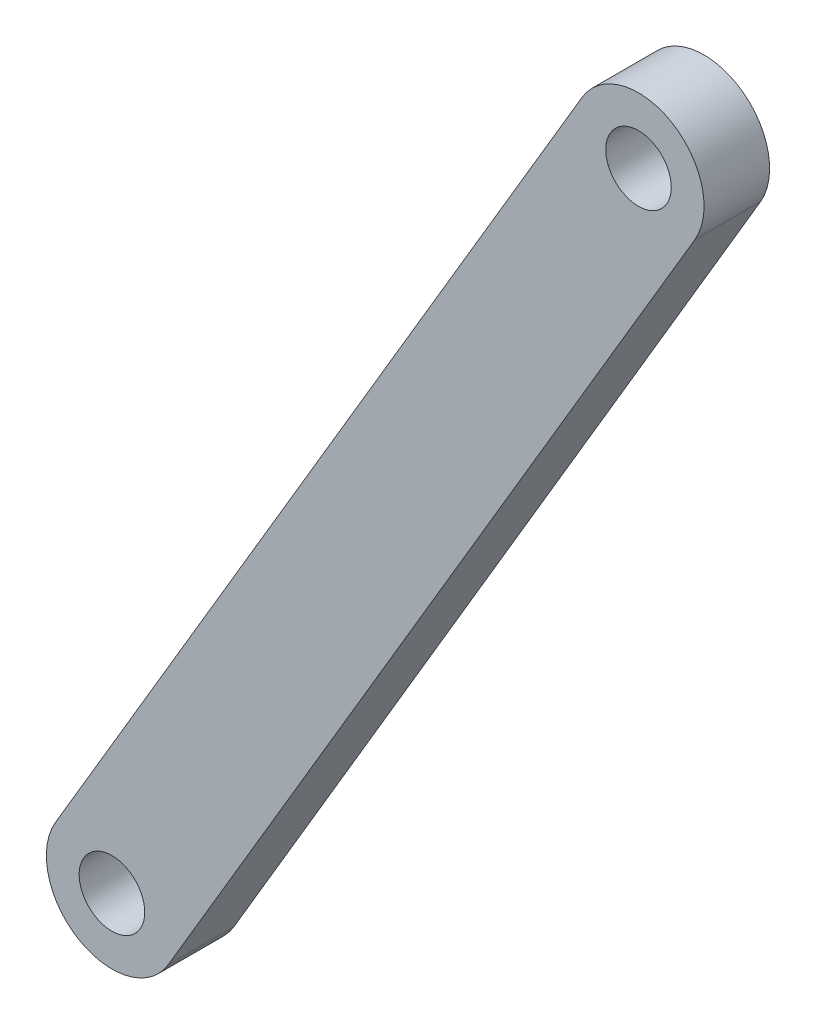
ISO-10303-21;
HEADER;
FILE_DESCRIPTION(('STEP AP214'),'2;1');
FILE_NAME('part.step','',(''),(''),'','','');
FILE_SCHEMA(('AUTOMOTIVE_DESIGN { 1 0 10303 214 1 1 1 1 }'));
ENDSEC;
DATA;
#1=APPLICATION_CONTEXT('core data for automotive mechanical design processes');
#2=APPLICATION_PROTOCOL_DEFINITION('international standard','automotive_design',2000,#1);
#3=PRODUCT_CONTEXT('',#1,'mechanical');
#4=PRODUCT('Part','Part','',(#3));
#5=PRODUCT_RELATED_PRODUCT_CATEGORY('part','',(#4));
#6=PRODUCT_DEFINITION_FORMATION('','',#4);
#7=PRODUCT_DEFINITION_CONTEXT('part definition',#1,'design');
#8=PRODUCT_DEFINITION('design','',#6,#7);
#9=PRODUCT_DEFINITION_SHAPE('','',#8);
#10=(LENGTH_UNIT() NAMED_UNIT(*) SI_UNIT(.MILLI.,.METRE.));
#11=(NAMED_UNIT(*) PLANE_ANGLE_UNIT() SI_UNIT($,.RADIAN.));
#12=(NAMED_UNIT(*) SI_UNIT($,.STERADIAN.) SOLID_ANGLE_UNIT());
#13=UNCERTAINTY_MEASURE_WITH_UNIT(LENGTH_MEASURE(1.E-05),#10,'distance_accuracy_value','');
#14=(GEOMETRIC_REPRESENTATION_CONTEXT(3) GLOBAL_UNCERTAINTY_ASSIGNED_CONTEXT((#13)) GLOBAL_UNIT_ASSIGNED_CONTEXT((#10,
#11,#12)) REPRESENTATION_CONTEXT('',''));
#15=CARTESIAN_POINT('',(0.,0.,0.));
#16=DIRECTION('',(0.,0.,1.));
#17=DIRECTION('',(1.,0.,0.));
#18=AXIS2_PLACEMENT_3D('',#15,#16,#17);
#19=CARTESIAN_POINT('',(101.398827582387,-86.3096763990368,6.35));
#20=DIRECTION('',(0.,0.,1.));
#21=DIRECTION('',(1.,0.,0.));
#22=AXIS2_PLACEMENT_3D('',#19,#20,#21);
#23=PLANE('',#22);
#24=CARTESIAN_POINT('',(152.4,0.,6.35));
#25=DIRECTION('',(0.,0.,1.));
#26=DIRECTION('',(1.,0.,0.));
#27=AXIS2_PLACEMENT_3D('',#24,#25,#26);
#28=CIRCLE('',#27,3.175);
#29=CARTESIAN_POINT('',(155.575,0.,6.35));
#30=VERTEX_POINT('',#29);
#31=EDGE_CURVE('E111',#30,#30,#28,.T.);
#32=ORIENTED_EDGE('',*,*,#31,.F.);
#33=EDGE_LOOP('',(#32));
#34=FACE_BOUND('',#33,.T.);
#35=CARTESIAN_POINT('',(101.398827582387,-86.3096763990368,6.35));
#36=DIRECTION('',(0.,0.,1.));
#37=DIRECTION('',(1.,0.,0.));
#38=AXIS2_PLACEMENT_3D('',#35,#36,#37);
#39=CIRCLE('',#38,6.35);
#40=CARTESIAN_POINT('',(95.9319441282264,-83.0792452670327,6.35));
#41=VERTEX_POINT('',#40);
#42=CARTESIAN_POINT('',(106.865711036548,-89.540107531041,6.35));
#43=VERTEX_POINT('',#42);
#44=EDGE_CURVE('E91',#41,#43,#39,.T.);
#45=ORIENTED_EDGE('',*,*,#44,.T.);
#46=DIRECTION('',(0.508729312126641,0.860926528214315,0.));
#47=VECTOR('',#46,1.);
#48=CARTESIAN_POINT('',(106.865711036548,-89.540107531041,6.35));
#49=LINE('',#48,#47);
#50=CARTESIAN_POINT('',(157.866883454161,-3.23043113200416,6.35));
#51=VERTEX_POINT('',#50);
#52=EDGE_CURVE('E86',#43,#51,#49,.T.);
#53=ORIENTED_EDGE('',*,*,#52,.T.);
#54=CARTESIAN_POINT('',(152.4,0.,6.35));
#55=DIRECTION('',(0.,0.,1.));
#56=DIRECTION('',(1.,0.,0.));
#57=AXIS2_PLACEMENT_3D('',#54,#55,#56);
#58=CIRCLE('',#57,6.35000000000001);
#59=CARTESIAN_POINT('',(146.933116545839,3.23043113200415,6.35));
#60=VERTEX_POINT('',#59);
#61=EDGE_CURVE('E89',#51,#60,#58,.T.);
#62=ORIENTED_EDGE('',*,*,#61,.T.);
#63=DIRECTION('',(-0.508729312126641,-0.860926528214315,0.));
#64=VECTOR('',#63,1.);
#65=CARTESIAN_POINT('',(95.9319441282264,-83.0792452670327,6.35));
#66=LINE('',#65,#64);
#67=EDGE_CURVE('E54',#60,#41,#66,.T.);
#68=ORIENTED_EDGE('',*,*,#67,.T.);
#69=EDGE_LOOP('',(#45,#53,#62,#68));
#70=FACE_BOUND('',#69,.T.);
#71=CARTESIAN_POINT('',(101.398827582387,-86.3096763990368,6.35));
#72=DIRECTION('',(0.,0.,1.));
#73=DIRECTION('',(1.,0.,0.));
#74=AXIS2_PLACEMENT_3D('',#71,#72,#73);
#75=CIRCLE('',#74,3.17499999999997);
#76=CARTESIAN_POINT('',(104.573827582387,-86.3096763990368,6.35));
#77=VERTEX_POINT('',#76);
#78=EDGE_CURVE('E130',#77,#77,#75,.T.);
#79=ORIENTED_EDGE('',*,*,#78,.F.);
#80=EDGE_LOOP('',(#79));
#81=FACE_BOUND('',#80,.T.);
#82=ADVANCED_FACE('F37',(#34,#70,#81),#23,.T.);
#83=CARTESIAN_POINT('',(101.398827582387,-86.3096763990368,0.));
#84=DIRECTION('',(0.,0.,1.));
#85=DIRECTION('',(1.,0.,0.));
#86=AXIS2_PLACEMENT_3D('',#83,#84,#85);
#87=PLANE('',#86);
#88=CARTESIAN_POINT('',(101.398827582387,-86.3096763990368,0.));
#89=DIRECTION('',(0.,0.,1.));
#90=DIRECTION('',(1.,0.,0.));
#91=AXIS2_PLACEMENT_3D('',#88,#89,#90);
#92=CIRCLE('',#91,6.35);
#93=CARTESIAN_POINT('',(95.9319441282264,-83.0792452670327,0.));
#94=VERTEX_POINT('',#93);
#95=CARTESIAN_POINT('',(106.865711036548,-89.540107531041,0.));
#96=VERTEX_POINT('',#95);
#97=EDGE_CURVE('E108',#94,#96,#92,.T.);
#98=ORIENTED_EDGE('',*,*,#97,.F.);
#99=DIRECTION('',(-0.508729312126641,-0.860926528214315,0.));
#100=VECTOR('',#99,1.);
#101=CARTESIAN_POINT('',(95.9319441282264,-83.0792452670327,0.));
#102=LINE('',#101,#100);
#103=CARTESIAN_POINT('',(146.933116545839,3.23043113200415,0.));
#104=VERTEX_POINT('',#103);
#105=EDGE_CURVE('E79',#104,#94,#102,.T.);
#106=ORIENTED_EDGE('',*,*,#105,.F.);
#107=CARTESIAN_POINT('',(152.4,0.,0.));
#108=DIRECTION('',(0.,0.,1.));
#109=DIRECTION('',(1.,0.,0.));
#110=AXIS2_PLACEMENT_3D('',#107,#108,#109);
#111=CIRCLE('',#110,6.35000000000001);
#112=CARTESIAN_POINT('',(157.866883454161,-3.23043113200416,0.));
#113=VERTEX_POINT('',#112);
#114=EDGE_CURVE('E73',#113,#104,#111,.T.);
#115=ORIENTED_EDGE('',*,*,#114,.F.);
#116=DIRECTION('',(0.508729312126641,0.860926528214315,0.));
#117=VECTOR('',#116,1.);
#118=CARTESIAN_POINT('',(106.865711036548,-89.540107531041,0.));
#119=LINE('',#118,#117);
#120=EDGE_CURVE('E96',#96,#113,#119,.T.);
#121=ORIENTED_EDGE('',*,*,#120,.F.);
#122=EDGE_LOOP('',(#98,#106,#115,#121));
#123=FACE_BOUND('',#122,.T.);
#124=CARTESIAN_POINT('',(152.4,0.,0.));
#125=DIRECTION('',(0.,0.,1.));
#126=DIRECTION('',(1.,0.,0.));
#127=AXIS2_PLACEMENT_3D('',#124,#125,#126);
#128=CIRCLE('',#127,3.175);
#129=CARTESIAN_POINT('',(155.575,0.,0.));
#130=VERTEX_POINT('',#129);
#131=EDGE_CURVE('E126',#130,#130,#128,.T.);
#132=ORIENTED_EDGE('',*,*,#131,.T.);
#133=EDGE_LOOP('',(#132));
#134=FACE_BOUND('',#133,.T.);
#135=CARTESIAN_POINT('',(101.398827582387,-86.3096763990368,0.));
#136=DIRECTION('',(0.,0.,1.));
#137=DIRECTION('',(1.,0.,0.));
#138=AXIS2_PLACEMENT_3D('',#135,#136,#137);
#139=CIRCLE('',#138,3.17499999999997);
#140=CARTESIAN_POINT('',(104.573827582387,-86.3096763990368,0.));
#141=VERTEX_POINT('',#140);
#142=EDGE_CURVE('E133',#141,#141,#139,.T.);
#143=ORIENTED_EDGE('',*,*,#142,.T.);
#144=EDGE_LOOP('',(#143));
#145=FACE_BOUND('',#144,.T.);
#146=ADVANCED_FACE('F122',(#123,#134,#145),#87,.F.);
#147=CARTESIAN_POINT('',(101.398827582387,-86.3096763990368,6.35));
#148=DIRECTION('',(0.,0.,-1.));
#149=DIRECTION('',(-1.,0.,0.));
#150=AXIS2_PLACEMENT_3D('',#147,#148,#149);
#151=CYLINDRICAL_SURFACE('',#150,6.35);
#152=ORIENTED_EDGE('',*,*,#97,.T.);
#153=DIRECTION('',(0.,0.,-1.));
#154=VECTOR('',#153,1.);
#155=CARTESIAN_POINT('',(106.865711036548,-89.540107531041,6.35));
#156=LINE('',#155,#154);
#157=EDGE_CURVE('E11',#43,#96,#156,.T.);
#158=ORIENTED_EDGE('',*,*,#157,.F.);
#159=ORIENTED_EDGE('',*,*,#44,.F.);
#160=DIRECTION('',(0.,0.,-1.));
#161=VECTOR('',#160,1.);
#162=CARTESIAN_POINT('',(95.9319441282264,-83.0792452670327,6.35));
#163=LINE('',#162,#161);
#164=EDGE_CURVE('E104',#41,#94,#163,.T.);
#165=ORIENTED_EDGE('',*,*,#164,.T.);
#166=EDGE_LOOP('',(#152,#158,#159,#165));
#167=FACE_BOUND('',#166,.T.);
#168=ADVANCED_FACE('F39',(#167),#151,.T.);
#169=CARTESIAN_POINT('',(106.865711036548,-89.540107531041,6.35));
#170=DIRECTION('',(-0.860926528214315,0.508729312126641,0.));
#171=DIRECTION('',(-0.508729312126641,-0.860926528214315,0.));
#172=AXIS2_PLACEMENT_3D('',#169,#170,#171);
#173=PLANE('',#172);
#174=ORIENTED_EDGE('',*,*,#120,.T.);
#175=DIRECTION('',(0.,0.,-1.));
#176=VECTOR('',#175,1.);
#177=CARTESIAN_POINT('',(157.866883454161,-3.23043113200416,6.35));
#178=LINE('',#177,#176);
#179=EDGE_CURVE('E46',#51,#113,#178,.T.);
#180=ORIENTED_EDGE('',*,*,#179,.F.);
#181=ORIENTED_EDGE('',*,*,#52,.F.);
#182=ORIENTED_EDGE('',*,*,#157,.T.);
#183=EDGE_LOOP('',(#174,#180,#181,#182));
#184=FACE_BOUND('',#183,.T.);
#185=ADVANCED_FACE('F95',(#184),#173,.F.);
#186=CARTESIAN_POINT('',(152.4,0.,6.35));
#187=DIRECTION('',(0.,0.,-1.));
#188=DIRECTION('',(-1.,0.,0.));
#189=AXIS2_PLACEMENT_3D('',#186,#187,#188);
#190=CYLINDRICAL_SURFACE('',#189,6.35000000000001);
#191=ORIENTED_EDGE('',*,*,#114,.T.);
#192=DIRECTION('',(0.,0.,-1.));
#193=VECTOR('',#192,1.);
#194=CARTESIAN_POINT('',(146.933116545839,3.23043113200415,6.35));
#195=LINE('',#194,#193);
#196=EDGE_CURVE('E97',#60,#104,#195,.T.);
#197=ORIENTED_EDGE('',*,*,#196,.F.);
#198=ORIENTED_EDGE('',*,*,#61,.F.);
#199=ORIENTED_EDGE('',*,*,#179,.T.);
#200=EDGE_LOOP('',(#191,#197,#198,#199));
#201=FACE_BOUND('',#200,.T.);
#202=ADVANCED_FACE('F98',(#201),#190,.T.);
#203=CARTESIAN_POINT('',(95.9319441282264,-83.0792452670327,6.35));
#204=DIRECTION('',(0.860926528214315,-0.508729312126641,0.));
#205=DIRECTION('',(0.508729312126641,0.860926528214315,0.));
#206=AXIS2_PLACEMENT_3D('',#203,#204,#205);
#207=PLANE('',#206);
#208=ORIENTED_EDGE('',*,*,#105,.T.);
#209=ORIENTED_EDGE('',*,*,#164,.F.);
#210=ORIENTED_EDGE('',*,*,#67,.F.);
#211=ORIENTED_EDGE('',*,*,#196,.T.);
#212=EDGE_LOOP('',(#208,#209,#210,#211));
#213=FACE_BOUND('',#212,.T.);
#214=ADVANCED_FACE('F119',(#213),#207,.F.);
#215=CARTESIAN_POINT('',(152.4,0.,6.35));
#216=DIRECTION('',(0.,0.,-1.));
#217=DIRECTION('',(-1.,0.,0.));
#218=AXIS2_PLACEMENT_3D('',#215,#216,#217);
#219=CYLINDRICAL_SURFACE('',#218,3.175);
#220=ORIENTED_EDGE('',*,*,#31,.T.);
#221=EDGE_LOOP('',(#220));
#222=FACE_BOUND('',#221,.T.);
#223=ORIENTED_EDGE('',*,*,#131,.F.);
#224=EDGE_LOOP('',(#223));
#225=FACE_BOUND('',#224,.T.);
#226=ADVANCED_FACE('F150',(#222,#225),#219,.F.);
#227=CARTESIAN_POINT('',(101.398827582387,-86.3096763990368,6.35));
#228=DIRECTION('',(0.,0.,-1.));
#229=DIRECTION('',(-1.,0.,0.));
#230=AXIS2_PLACEMENT_3D('',#227,#228,#229);
#231=CYLINDRICAL_SURFACE('',#230,3.17499999999997);
#232=ORIENTED_EDGE('',*,*,#78,.T.);
#233=EDGE_LOOP('',(#232));
#234=FACE_BOUND('',#233,.T.);
#235=ORIENTED_EDGE('',*,*,#142,.F.);
#236=EDGE_LOOP('',(#235));
#237=FACE_BOUND('',#236,.T.);
#238=ADVANCED_FACE('F139',(#234,#237),#231,.F.);
#239=CLOSED_SHELL('',(#82,#146,#168,#185,#202,#214,#226,#238));
#240=MANIFOLD_SOLID_BREP('B2',#239);
#241=ADVANCED_BREP_SHAPE_REPRESENTATION('',(#18,#240),#14);
#242=SHAPE_DEFINITION_REPRESENTATION(#9,#241);
ENDSEC;
END-ISO-10303-21;
